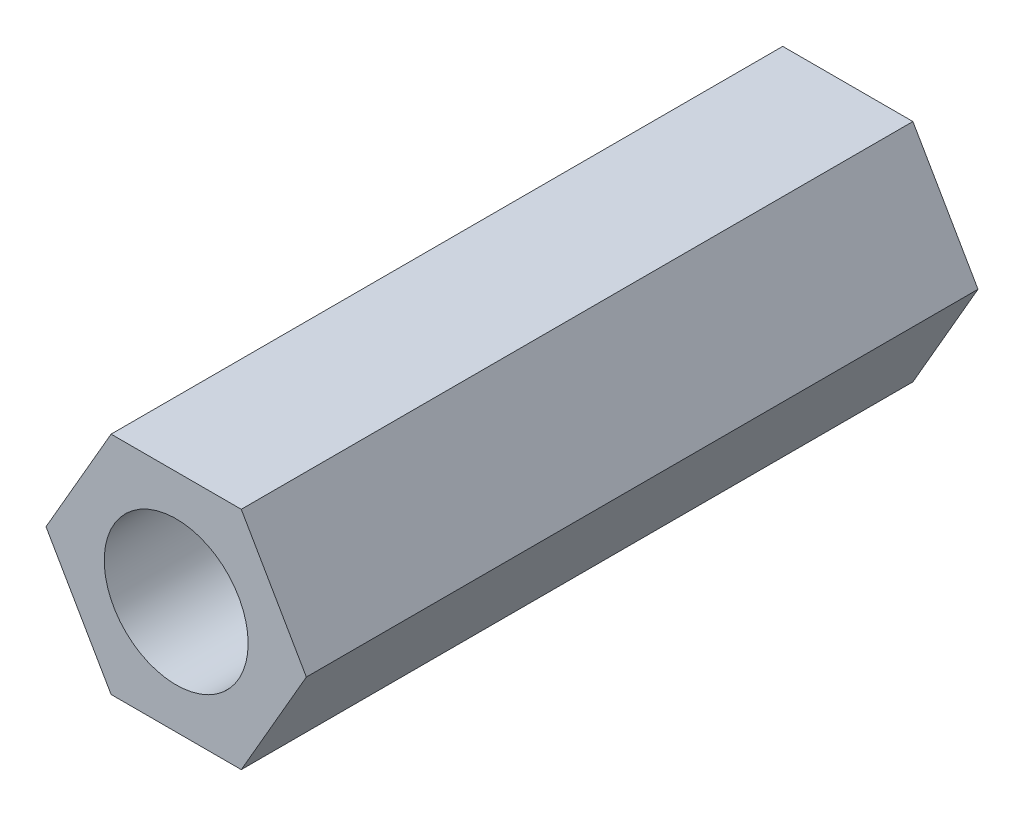
ISO-10303-21;
HEADER;
FILE_DESCRIPTION(('STEP AP214'),'2;1');
FILE_NAME('part.step','',(''),(''),'','','');
FILE_SCHEMA(('AUTOMOTIVE_DESIGN { 1 0 10303 214 1 1 1 1 }'));
ENDSEC;
DATA;
#1=APPLICATION_CONTEXT('core data for automotive mechanical design processes');
#2=APPLICATION_PROTOCOL_DEFINITION('international standard','automotive_design',2000,#1);
#3=PRODUCT_CONTEXT('',#1,'mechanical');
#4=PRODUCT('Part','Part','',(#3));
#5=PRODUCT_RELATED_PRODUCT_CATEGORY('part','',(#4));
#6=PRODUCT_DEFINITION_FORMATION('','',#4);
#7=PRODUCT_DEFINITION_CONTEXT('part definition',#1,'design');
#8=PRODUCT_DEFINITION('design','',#6,#7);
#9=PRODUCT_DEFINITION_SHAPE('','',#8);
#10=(LENGTH_UNIT() NAMED_UNIT(*) SI_UNIT(.MILLI.,.METRE.));
#11=(NAMED_UNIT(*) PLANE_ANGLE_UNIT() SI_UNIT($,.RADIAN.));
#12=(NAMED_UNIT(*) SI_UNIT($,.STERADIAN.) SOLID_ANGLE_UNIT());
#13=UNCERTAINTY_MEASURE_WITH_UNIT(LENGTH_MEASURE(1.E-05),#10,'distance_accuracy_value','');
#14=(GEOMETRIC_REPRESENTATION_CONTEXT(3) GLOBAL_UNCERTAINTY_ASSIGNED_CONTEXT((#13)) GLOBAL_UNIT_ASSIGNED_CONTEXT((#10,
#11,#12)) REPRESENTATION_CONTEXT('',''));
#15=CARTESIAN_POINT('',(0.,0.,0.));
#16=DIRECTION('',(0.,0.,1.));
#17=DIRECTION('',(1.,0.,0.));
#18=AXIS2_PLACEMENT_3D('',#15,#16,#17);
#19=CARTESIAN_POINT('',(0.,0.,14.));
#20=DIRECTION('',(0.,0.,1.));
#21=DIRECTION('',(1.,0.,0.));
#22=AXIS2_PLACEMENT_3D('',#19,#20,#21);
#23=PLANE('',#22);
#24=DIRECTION('',(-0.5,0.866025403784439,0.));
#25=VECTOR('',#24,1.);
#26=CARTESIAN_POINT('',(2.71354626519124,0.,14.));
#27=LINE('',#26,#25);
#28=CARTESIAN_POINT('',(2.71354626519124,0.,14.));
#29=VERTEX_POINT('',#28);
#30=CARTESIAN_POINT('',(1.35677313259562,2.35,14.));
#31=VERTEX_POINT('',#30);
#32=EDGE_CURVE('E128',#29,#31,#27,.T.);
#33=ORIENTED_EDGE('',*,*,#32,.T.);
#34=DIRECTION('',(-1.,0.,0.));
#35=VECTOR('',#34,1.);
#36=CARTESIAN_POINT('',(1.35677313259562,2.35,14.));
#37=LINE('',#36,#35);
#38=CARTESIAN_POINT('',(-1.35677313259562,2.35,14.));
#39=VERTEX_POINT('',#38);
#40=EDGE_CURVE('E86',#31,#39,#37,.T.);
#41=ORIENTED_EDGE('',*,*,#40,.T.);
#42=DIRECTION('',(-0.5,-0.866025403784439,0.));
#43=VECTOR('',#42,1.);
#44=CARTESIAN_POINT('',(-1.35677313259562,2.35,14.));
#45=LINE('',#44,#43);
#46=CARTESIAN_POINT('',(-2.71354626519124,0.,14.));
#47=VERTEX_POINT('',#46);
#48=EDGE_CURVE('E99',#39,#47,#45,.T.);
#49=ORIENTED_EDGE('',*,*,#48,.T.);
#50=DIRECTION('',(0.5,-0.866025403784439,0.));
#51=VECTOR('',#50,1.);
#52=CARTESIAN_POINT('',(-2.71354626519124,0.,14.));
#53=LINE('',#52,#51);
#54=CARTESIAN_POINT('',(-1.35677313259562,-2.35,14.));
#55=VERTEX_POINT('',#54);
#56=EDGE_CURVE('E93',#47,#55,#53,.T.);
#57=ORIENTED_EDGE('',*,*,#56,.T.);
#58=DIRECTION('',(1.,0.,0.));
#59=VECTOR('',#58,1.);
#60=CARTESIAN_POINT('',(-1.35677313259562,-2.35,14.));
#61=LINE('',#60,#59);
#62=CARTESIAN_POINT('',(1.35677313259562,-2.35,14.));
#63=VERTEX_POINT('',#62);
#64=EDGE_CURVE('E97',#55,#63,#61,.T.);
#65=ORIENTED_EDGE('',*,*,#64,.T.);
#66=DIRECTION('',(0.5,0.866025403784439,0.));
#67=VECTOR('',#66,1.);
#68=CARTESIAN_POINT('',(1.35677313259562,-2.35,14.));
#69=LINE('',#68,#67);
#70=EDGE_CURVE('E49',#63,#29,#69,.T.);
#71=ORIENTED_EDGE('',*,*,#70,.T.);
#72=EDGE_LOOP('',(#33,#41,#49,#57,#65,#71));
#73=FACE_BOUND('',#72,.T.);
#74=CARTESIAN_POINT('',(0.,0.,14.));
#75=DIRECTION('',(0.,0.,1.));
#76=DIRECTION('',(1.,0.,0.));
#77=AXIS2_PLACEMENT_3D('',#74,#75,#76);
#78=CIRCLE('',#77,1.5);
#79=CARTESIAN_POINT('',(1.5,0.,14.));
#80=VERTEX_POINT('',#79);
#81=EDGE_CURVE('E121',#80,#80,#78,.T.);
#82=ORIENTED_EDGE('',*,*,#81,.F.);
#83=EDGE_LOOP('',(#82));
#84=FACE_BOUND('',#83,.T.);
#85=ADVANCED_FACE('F32',(#73,#84),#23,.T.);
#86=CARTESIAN_POINT('',(0.,0.,0.));
#87=DIRECTION('',(0.,0.,1.));
#88=DIRECTION('',(1.,0.,0.));
#89=AXIS2_PLACEMENT_3D('',#86,#87,#88);
#90=PLANE('',#89);
#91=DIRECTION('',(-0.5,0.866025403784439,0.));
#92=VECTOR('',#91,1.);
#93=CARTESIAN_POINT('',(2.71354626519124,0.,0.));
#94=LINE('',#93,#92);
#95=CARTESIAN_POINT('',(2.71354626519124,0.,0.));
#96=VERTEX_POINT('',#95);
#97=CARTESIAN_POINT('',(1.35677313259562,2.35,0.));
#98=VERTEX_POINT('',#97);
#99=EDGE_CURVE('E117',#96,#98,#94,.T.);
#100=ORIENTED_EDGE('',*,*,#99,.F.);
#101=DIRECTION('',(0.5,0.866025403784439,0.));
#102=VECTOR('',#101,1.);
#103=CARTESIAN_POINT('',(1.35677313259562,-2.35,0.));
#104=LINE('',#103,#102);
#105=CARTESIAN_POINT('',(1.35677313259562,-2.35,0.));
#106=VERTEX_POINT('',#105);
#107=EDGE_CURVE('E78',#106,#96,#104,.T.);
#108=ORIENTED_EDGE('',*,*,#107,.F.);
#109=DIRECTION('',(1.,0.,0.));
#110=VECTOR('',#109,1.);
#111=CARTESIAN_POINT('',(-1.35677313259562,-2.35,0.));
#112=LINE('',#111,#110);
#113=CARTESIAN_POINT('',(-1.35677313259562,-2.35,0.));
#114=VERTEX_POINT('',#113);
#115=EDGE_CURVE('E72',#114,#106,#112,.T.);
#116=ORIENTED_EDGE('',*,*,#115,.F.);
#117=DIRECTION('',(0.5,-0.866025403784439,0.));
#118=VECTOR('',#117,1.);
#119=CARTESIAN_POINT('',(-2.71354626519124,0.,0.));
#120=LINE('',#119,#118);
#121=CARTESIAN_POINT('',(-2.71354626519124,0.,0.));
#122=VERTEX_POINT('',#121);
#123=EDGE_CURVE('E107',#122,#114,#120,.T.);
#124=ORIENTED_EDGE('',*,*,#123,.F.);
#125=DIRECTION('',(-0.5,-0.866025403784439,0.));
#126=VECTOR('',#125,1.);
#127=CARTESIAN_POINT('',(-1.35677313259562,2.35,0.));
#128=LINE('',#127,#126);
#129=CARTESIAN_POINT('',(-1.35677313259562,2.35,0.));
#130=VERTEX_POINT('',#129);
#131=EDGE_CURVE('E123',#130,#122,#128,.T.);
#132=ORIENTED_EDGE('',*,*,#131,.F.);
#133=DIRECTION('',(-1.,0.,0.));
#134=VECTOR('',#133,1.);
#135=CARTESIAN_POINT('',(1.35677313259562,2.35,0.));
#136=LINE('',#135,#134);
#137=EDGE_CURVE('E120',#98,#130,#136,.T.);
#138=ORIENTED_EDGE('',*,*,#137,.F.);
#139=EDGE_LOOP('',(#100,#108,#116,#124,#132,#138));
#140=FACE_BOUND('',#139,.T.);
#141=CARTESIAN_POINT('',(0.,0.,0.));
#142=DIRECTION('',(0.,0.,1.));
#143=DIRECTION('',(1.,0.,0.));
#144=AXIS2_PLACEMENT_3D('',#141,#142,#143);
#145=CIRCLE('',#144,1.5);
#146=CARTESIAN_POINT('',(1.5,0.,0.));
#147=VERTEX_POINT('',#146);
#148=EDGE_CURVE('E221',#147,#147,#145,.T.);
#149=ORIENTED_EDGE('',*,*,#148,.T.);
#150=EDGE_LOOP('',(#149));
#151=FACE_BOUND('',#150,.T.);
#152=ADVANCED_FACE('F137',(#140,#151),#90,.F.);
#153=CARTESIAN_POINT('',(2.71354626519124,0.,14.));
#154=DIRECTION('',(-0.866025403784438,-0.5,0.));
#155=DIRECTION('',(0.5,-0.866025403784439,0.));
#156=AXIS2_PLACEMENT_3D('',#153,#154,#155);
#157=PLANE('',#156);
#158=ORIENTED_EDGE('',*,*,#99,.T.);
#159=DIRECTION('',(0.,0.,-1.));
#160=VECTOR('',#159,1.);
#161=CARTESIAN_POINT('',(1.35677313259562,2.35,14.));
#162=LINE('',#161,#160);
#163=EDGE_CURVE('E11',#31,#98,#162,.T.);
#164=ORIENTED_EDGE('',*,*,#163,.F.);
#165=ORIENTED_EDGE('',*,*,#32,.F.);
#166=DIRECTION('',(0.,0.,-1.));
#167=VECTOR('',#166,1.);
#168=CARTESIAN_POINT('',(2.71354626519124,0.,14.));
#169=LINE('',#168,#167);
#170=EDGE_CURVE('E113',#29,#96,#169,.T.);
#171=ORIENTED_EDGE('',*,*,#170,.T.);
#172=EDGE_LOOP('',(#158,#164,#165,#171));
#173=FACE_BOUND('',#172,.T.);
#174=ADVANCED_FACE('F34',(#173),#157,.F.);
#175=CARTESIAN_POINT('',(1.35677313259562,2.35,14.));
#176=DIRECTION('',(0.,-1.,0.));
#177=DIRECTION('',(0.,0.,-1.));
#178=AXIS2_PLACEMENT_3D('',#175,#176,#177);
#179=PLANE('',#178);
#180=ORIENTED_EDGE('',*,*,#137,.T.);
#181=DIRECTION('',(0.,0.,-1.));
#182=VECTOR('',#181,1.);
#183=CARTESIAN_POINT('',(-1.35677313259562,2.35,14.));
#184=LINE('',#183,#182);
#185=EDGE_CURVE('E41',#39,#130,#184,.T.);
#186=ORIENTED_EDGE('',*,*,#185,.F.);
#187=ORIENTED_EDGE('',*,*,#40,.F.);
#188=ORIENTED_EDGE('',*,*,#163,.T.);
#189=EDGE_LOOP('',(#180,#186,#187,#188));
#190=FACE_BOUND('',#189,.T.);
#191=ADVANCED_FACE('F162',(#190),#179,.F.);
#192=CARTESIAN_POINT('',(-1.35677313259562,2.35,14.));
#193=DIRECTION('',(0.866025403784439,-0.5,0.));
#194=DIRECTION('',(0.5,0.866025403784439,0.));
#195=AXIS2_PLACEMENT_3D('',#192,#193,#194);
#196=PLANE('',#195);
#197=ORIENTED_EDGE('',*,*,#131,.T.);
#198=DIRECTION('',(0.,0.,-1.));
#199=VECTOR('',#198,1.);
#200=CARTESIAN_POINT('',(-2.71354626519124,0.,14.));
#201=LINE('',#200,#199);
#202=EDGE_CURVE('E108',#47,#122,#201,.T.);
#203=ORIENTED_EDGE('',*,*,#202,.F.);
#204=ORIENTED_EDGE('',*,*,#48,.F.);
#205=ORIENTED_EDGE('',*,*,#185,.T.);
#206=EDGE_LOOP('',(#197,#203,#204,#205));
#207=FACE_BOUND('',#206,.T.);
#208=ADVANCED_FACE('F134',(#207),#196,.F.);
#209=CARTESIAN_POINT('',(-2.71354626519124,0.,14.));
#210=DIRECTION('',(0.866025403784439,0.5,0.));
#211=DIRECTION('',(-0.5,0.866025403784439,0.));
#212=AXIS2_PLACEMENT_3D('',#209,#210,#211);
#213=PLANE('',#212);
#214=ORIENTED_EDGE('',*,*,#123,.T.);
#215=DIRECTION('',(0.,0.,-1.));
#216=VECTOR('',#215,1.);
#217=CARTESIAN_POINT('',(-1.35677313259562,-2.35,14.));
#218=LINE('',#217,#216);
#219=EDGE_CURVE('E104',#55,#114,#218,.T.);
#220=ORIENTED_EDGE('',*,*,#219,.F.);
#221=ORIENTED_EDGE('',*,*,#56,.F.);
#222=ORIENTED_EDGE('',*,*,#202,.T.);
#223=EDGE_LOOP('',(#214,#220,#221,#222));
#224=FACE_BOUND('',#223,.T.);
#225=ADVANCED_FACE('F105',(#224),#213,.F.);
#226=CARTESIAN_POINT('',(-1.35677313259562,-2.35,14.));
#227=DIRECTION('',(0.,1.,0.));
#228=DIRECTION('',(0.,0.,1.));
#229=AXIS2_PLACEMENT_3D('',#226,#227,#228);
#230=PLANE('',#229);
#231=ORIENTED_EDGE('',*,*,#115,.T.);
#232=DIRECTION('',(0.,0.,-1.));
#233=VECTOR('',#232,1.);
#234=CARTESIAN_POINT('',(1.35677313259562,-2.35,14.));
#235=LINE('',#234,#233);
#236=EDGE_CURVE('E109',#63,#106,#235,.T.);
#237=ORIENTED_EDGE('',*,*,#236,.F.);
#238=ORIENTED_EDGE('',*,*,#64,.F.);
#239=ORIENTED_EDGE('',*,*,#219,.T.);
#240=EDGE_LOOP('',(#231,#237,#238,#239));
#241=FACE_BOUND('',#240,.T.);
#242=ADVANCED_FACE('F111',(#241),#230,.F.);
#243=CARTESIAN_POINT('',(1.35677313259562,-2.35,14.));
#244=DIRECTION('',(-0.866025403784439,0.5,0.));
#245=DIRECTION('',(-0.5,-0.866025403784439,0.));
#246=AXIS2_PLACEMENT_3D('',#243,#244,#245);
#247=PLANE('',#246);
#248=ORIENTED_EDGE('',*,*,#107,.T.);
#249=ORIENTED_EDGE('',*,*,#170,.F.);
#250=ORIENTED_EDGE('',*,*,#70,.F.);
#251=ORIENTED_EDGE('',*,*,#236,.T.);
#252=EDGE_LOOP('',(#248,#249,#250,#251));
#253=FACE_BOUND('',#252,.T.);
#254=ADVANCED_FACE('F142',(#253),#247,.F.);
#255=CARTESIAN_POINT('',(0.,0.,14.));
#256=DIRECTION('',(0.,0.,-1.));
#257=DIRECTION('',(-1.,0.,0.));
#258=AXIS2_PLACEMENT_3D('',#255,#256,#257);
#259=CYLINDRICAL_SURFACE('',#258,1.5);
#260=ORIENTED_EDGE('',*,*,#81,.T.);
#261=EDGE_LOOP('',(#260));
#262=FACE_BOUND('',#261,.T.);
#263=ORIENTED_EDGE('',*,*,#148,.F.);
#264=EDGE_LOOP('',(#263));
#265=FACE_BOUND('',#264,.T.);
#266=ADVANCED_FACE('F144',(#262,#265),#259,.F.);
#267=CLOSED_SHELL('',(#85,#152,#174,#191,#208,#225,#242,#254,#266));
#268=MANIFOLD_SOLID_BREP('B2',#267);
#269=ADVANCED_BREP_SHAPE_REPRESENTATION('',(#18,#268),#14);
#270=SHAPE_DEFINITION_REPRESENTATION(#9,#269);
ENDSEC;
END-ISO-10303-21;
